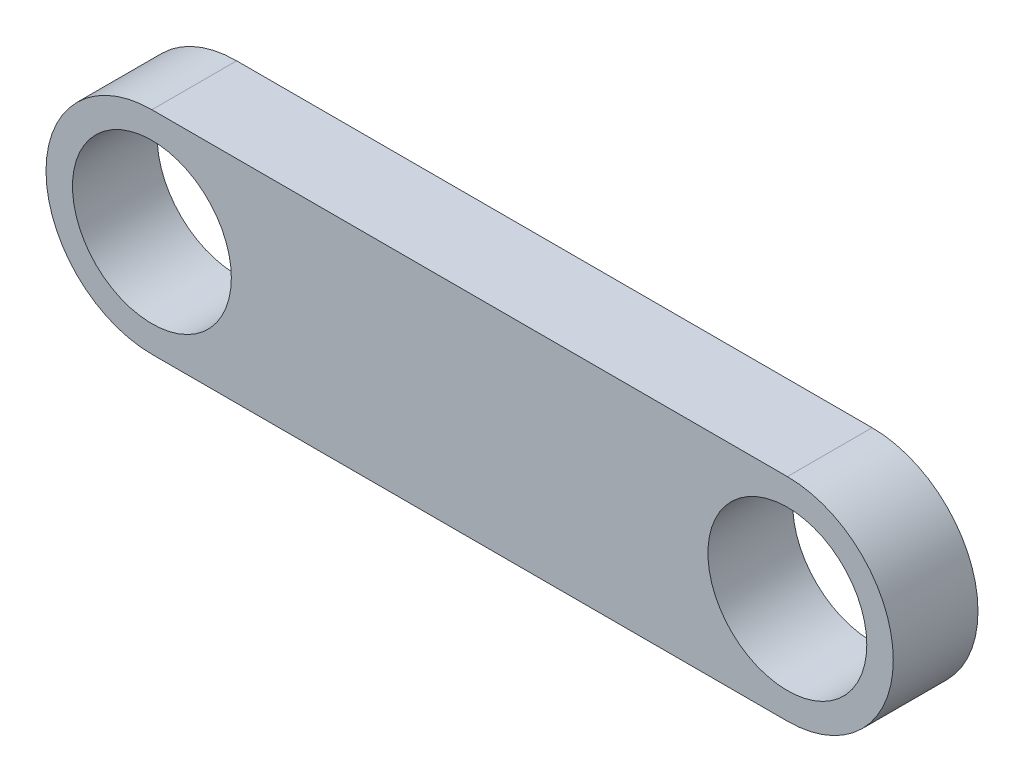
ISO-10303-21;
HEADER;
FILE_DESCRIPTION(('STEP AP214'),'2;1');
FILE_NAME('part.step','',(''),(''),'','','');
FILE_SCHEMA(('AUTOMOTIVE_DESIGN { 1 0 10303 214 1 1 1 1 }'));
ENDSEC;
DATA;
#1=APPLICATION_CONTEXT('core data for automotive mechanical design processes');
#2=APPLICATION_PROTOCOL_DEFINITION('international standard','automotive_design',2000,#1);
#3=PRODUCT_CONTEXT('',#1,'mechanical');
#4=PRODUCT('Part','Part','',(#3));
#5=PRODUCT_RELATED_PRODUCT_CATEGORY('part','',(#4));
#6=PRODUCT_DEFINITION_FORMATION('','',#4);
#7=PRODUCT_DEFINITION_CONTEXT('part definition',#1,'design');
#8=PRODUCT_DEFINITION('design','',#6,#7);
#9=PRODUCT_DEFINITION_SHAPE('','',#8);
#10=(LENGTH_UNIT() NAMED_UNIT(*) SI_UNIT(.MILLI.,.METRE.));
#11=(NAMED_UNIT(*) PLANE_ANGLE_UNIT() SI_UNIT($,.RADIAN.));
#12=(NAMED_UNIT(*) SI_UNIT($,.STERADIAN.) SOLID_ANGLE_UNIT());
#13=UNCERTAINTY_MEASURE_WITH_UNIT(LENGTH_MEASURE(1.E-05),#10,'distance_accuracy_value','');
#14=(GEOMETRIC_REPRESENTATION_CONTEXT(3) GLOBAL_UNCERTAINTY_ASSIGNED_CONTEXT((#13)) GLOBAL_UNIT_ASSIGNED_CONTEXT((#10,
#11,#12)) REPRESENTATION_CONTEXT('',''));
#15=CARTESIAN_POINT('',(0.,0.,0.));
#16=DIRECTION('',(0.,0.,1.));
#17=DIRECTION('',(1.,0.,0.));
#18=AXIS2_PLACEMENT_3D('',#15,#16,#17);
#19=CARTESIAN_POINT('',(0.,0.,-40.));
#20=DIRECTION('',(0.,0.,1.));
#21=DIRECTION('',(1.,0.,0.));
#22=AXIS2_PLACEMENT_3D('',#19,#20,#21);
#23=CYLINDRICAL_SURFACE('',#22,100.);
#24=DIRECTION('',(0.,0.,1.));
#25=VECTOR('',#24,1.);
#26=CARTESIAN_POINT('',(0.,-100.,-40.));
#27=LINE('',#26,#25);
#28=CARTESIAN_POINT('',(0.,-100.,-40.));
#29=VERTEX_POINT('',#28);
#30=CARTESIAN_POINT('',(0.,-100.,40.));
#31=VERTEX_POINT('',#30);
#32=EDGE_CURVE('E95',#29,#31,#27,.T.);
#33=ORIENTED_EDGE('',*,*,#32,.T.);
#34=CARTESIAN_POINT('',(0.,0.,40.));
#35=DIRECTION('',(0.,0.,1.));
#36=DIRECTION('',(1.,0.,0.));
#37=AXIS2_PLACEMENT_3D('',#34,#35,#36);
#38=CIRCLE('',#37,100.);
#39=CARTESIAN_POINT('',(0.,100.,40.));
#40=VERTEX_POINT('',#39);
#41=EDGE_CURVE('E98',#40,#31,#38,.T.);
#42=ORIENTED_EDGE('',*,*,#41,.F.);
#43=DIRECTION('',(0.,0.,1.));
#44=VECTOR('',#43,1.);
#45=CARTESIAN_POINT('',(0.,100.,-40.));
#46=LINE('',#45,#44);
#47=CARTESIAN_POINT('',(0.,100.,-40.));
#48=VERTEX_POINT('',#47);
#49=EDGE_CURVE('E12',#48,#40,#46,.T.);
#50=ORIENTED_EDGE('',*,*,#49,.F.);
#51=CARTESIAN_POINT('',(0.,0.,-40.));
#52=DIRECTION('',(0.,0.,1.));
#53=DIRECTION('',(1.,0.,0.));
#54=AXIS2_PLACEMENT_3D('',#51,#52,#53);
#55=CIRCLE('',#54,100.);
#56=EDGE_CURVE('E100',#48,#29,#55,.T.);
#57=ORIENTED_EDGE('',*,*,#56,.T.);
#58=EDGE_LOOP('',(#33,#42,#50,#57));
#59=FACE_BOUND('',#58,.T.);
#60=ADVANCED_FACE('F55',(#59),#23,.T.);
#61=CARTESIAN_POINT('',(0.,100.,-40.));
#62=DIRECTION('',(0.,-1.,0.));
#63=DIRECTION('',(0.,0.,-1.));
#64=AXIS2_PLACEMENT_3D('',#61,#62,#63);
#65=PLANE('',#64);
#66=ORIENTED_EDGE('',*,*,#49,.T.);
#67=DIRECTION('',(1.,0.,0.));
#68=VECTOR('',#67,1.);
#69=CARTESIAN_POINT('',(0.,100.,40.));
#70=LINE('',#69,#68);
#71=CARTESIAN_POINT('',(600.,100.,40.));
#72=VERTEX_POINT('',#71);
#73=EDGE_CURVE('E118',#40,#72,#70,.T.);
#74=ORIENTED_EDGE('',*,*,#73,.T.);
#75=DIRECTION('',(0.,0.,1.));
#76=VECTOR('',#75,1.);
#77=CARTESIAN_POINT('',(600.,100.,-40.));
#78=LINE('',#77,#76);
#79=CARTESIAN_POINT('',(600.,100.,-40.));
#80=VERTEX_POINT('',#79);
#81=EDGE_CURVE('E64',#80,#72,#78,.T.);
#82=ORIENTED_EDGE('',*,*,#81,.F.);
#83=DIRECTION('',(1.,0.,0.));
#84=VECTOR('',#83,1.);
#85=CARTESIAN_POINT('',(0.,100.,-40.));
#86=LINE('',#85,#84);
#87=EDGE_CURVE('E77',#48,#80,#86,.T.);
#88=ORIENTED_EDGE('',*,*,#87,.F.);
#89=EDGE_LOOP('',(#66,#74,#82,#88));
#90=FACE_BOUND('',#89,.T.);
#91=ADVANCED_FACE('F170',(#90),#65,.F.);
#92=CARTESIAN_POINT('',(600.,0.,-40.));
#93=DIRECTION('',(0.,0.,1.));
#94=DIRECTION('',(1.,0.,0.));
#95=AXIS2_PLACEMENT_3D('',#92,#93,#94);
#96=CYLINDRICAL_SURFACE('',#95,100.);
#97=ORIENTED_EDGE('',*,*,#81,.T.);
#98=CARTESIAN_POINT('',(600.,0.,40.));
#99=DIRECTION('',(0.,0.,1.));
#100=DIRECTION('',(1.,0.,0.));
#101=AXIS2_PLACEMENT_3D('',#98,#99,#100);
#102=CIRCLE('',#101,100.);
#103=CARTESIAN_POINT('',(600.,-100.,40.));
#104=VERTEX_POINT('',#103);
#105=EDGE_CURVE('E114',#104,#72,#102,.T.);
#106=ORIENTED_EDGE('',*,*,#105,.F.);
#107=DIRECTION('',(0.,0.,1.));
#108=VECTOR('',#107,1.);
#109=CARTESIAN_POINT('',(600.,-100.,-40.));
#110=LINE('',#109,#108);
#111=CARTESIAN_POINT('',(600.,-100.,-40.));
#112=VERTEX_POINT('',#111);
#113=EDGE_CURVE('E105',#112,#104,#110,.T.);
#114=ORIENTED_EDGE('',*,*,#113,.F.);
#115=CARTESIAN_POINT('',(600.,0.,-40.));
#116=DIRECTION('',(0.,0.,1.));
#117=DIRECTION('',(1.,0.,0.));
#118=AXIS2_PLACEMENT_3D('',#115,#116,#117);
#119=CIRCLE('',#118,100.);
#120=EDGE_CURVE('E137',#112,#80,#119,.T.);
#121=ORIENTED_EDGE('',*,*,#120,.T.);
#122=EDGE_LOOP('',(#97,#106,#114,#121));
#123=FACE_BOUND('',#122,.T.);
#124=ADVANCED_FACE('F174',(#123),#96,.T.);
#125=CARTESIAN_POINT('',(0.,-100.,-40.));
#126=DIRECTION('',(0.,-1.,0.));
#127=DIRECTION('',(0.,0.,-1.));
#128=AXIS2_PLACEMENT_3D('',#125,#126,#127);
#129=PLANE('',#128);
#130=ORIENTED_EDGE('',*,*,#113,.T.);
#131=DIRECTION('',(1.,0.,0.));
#132=VECTOR('',#131,1.);
#133=CARTESIAN_POINT('',(0.,-100.,40.));
#134=LINE('',#133,#132);
#135=EDGE_CURVE('E108',#31,#104,#134,.T.);
#136=ORIENTED_EDGE('',*,*,#135,.F.);
#137=ORIENTED_EDGE('',*,*,#32,.F.);
#138=DIRECTION('',(1.,0.,0.));
#139=VECTOR('',#138,1.);
#140=CARTESIAN_POINT('',(0.,-100.,-40.));
#141=LINE('',#140,#139);
#142=EDGE_CURVE('E134',#29,#112,#141,.T.);
#143=ORIENTED_EDGE('',*,*,#142,.T.);
#144=EDGE_LOOP('',(#130,#136,#137,#143));
#145=FACE_BOUND('',#144,.T.);
#146=ADVANCED_FACE('F109',(#145),#129,.T.);
#147=CARTESIAN_POINT('',(0.,0.,-40.));
#148=DIRECTION('',(0.,0.,1.));
#149=DIRECTION('',(1.,0.,0.));
#150=AXIS2_PLACEMENT_3D('',#147,#148,#149);
#151=PLANE('',#150);
#152=CARTESIAN_POINT('',(600.,0.,-40.));
#153=DIRECTION('',(0.,0.,1.));
#154=DIRECTION('',(1.,0.,0.));
#155=AXIS2_PLACEMENT_3D('',#152,#153,#154);
#156=CIRCLE('',#155,75.);
#157=CARTESIAN_POINT('',(675.,0.,-40.));
#158=VERTEX_POINT('',#157);
#159=EDGE_CURVE('E148',#158,#158,#156,.F.);
#160=ORIENTED_EDGE('',*,*,#159,.F.);
#161=EDGE_LOOP('',(#160));
#162=FACE_BOUND('',#161,.T.);
#163=CARTESIAN_POINT('',(0.,0.,-40.));
#164=DIRECTION('',(0.,0.,1.));
#165=DIRECTION('',(1.,0.,0.));
#166=AXIS2_PLACEMENT_3D('',#163,#164,#165);
#167=CIRCLE('',#166,75.);
#168=CARTESIAN_POINT('',(75.,0.,-40.));
#169=VERTEX_POINT('',#168);
#170=EDGE_CURVE('E120',#169,#169,#167,.F.);
#171=ORIENTED_EDGE('',*,*,#170,.F.);
#172=EDGE_LOOP('',(#171));
#173=FACE_BOUND('',#172,.T.);
#174=ORIENTED_EDGE('',*,*,#56,.F.);
#175=ORIENTED_EDGE('',*,*,#87,.T.);
#176=ORIENTED_EDGE('',*,*,#120,.F.);
#177=ORIENTED_EDGE('',*,*,#142,.F.);
#178=EDGE_LOOP('',(#174,#175,#176,#177));
#179=FACE_BOUND('',#178,.T.);
#180=ADVANCED_FACE('F183',(#162,#173,#179),#151,.F.);
#181=CARTESIAN_POINT('',(0.,0.,40.));
#182=DIRECTION('',(0.,0.,1.));
#183=DIRECTION('',(1.,0.,0.));
#184=AXIS2_PLACEMENT_3D('',#181,#182,#183);
#185=PLANE('',#184);
#186=CARTESIAN_POINT('',(600.,0.,40.));
#187=DIRECTION('',(0.,0.,1.));
#188=DIRECTION('',(1.,0.,0.));
#189=AXIS2_PLACEMENT_3D('',#186,#187,#188);
#190=CIRCLE('',#189,75.);
#191=CARTESIAN_POINT('',(675.,0.,40.));
#192=VERTEX_POINT('',#191);
#193=EDGE_CURVE('E58',#192,#192,#190,.F.);
#194=ORIENTED_EDGE('',*,*,#193,.T.);
#195=EDGE_LOOP('',(#194));
#196=FACE_BOUND('',#195,.T.);
#197=CARTESIAN_POINT('',(0.,0.,40.));
#198=DIRECTION('',(0.,0.,1.));
#199=DIRECTION('',(1.,0.,0.));
#200=AXIS2_PLACEMENT_3D('',#197,#198,#199);
#201=CIRCLE('',#200,75.);
#202=CARTESIAN_POINT('',(75.,0.,40.));
#203=VERTEX_POINT('',#202);
#204=EDGE_CURVE('E124',#203,#203,#201,.F.);
#205=ORIENTED_EDGE('',*,*,#204,.T.);
#206=EDGE_LOOP('',(#205));
#207=FACE_BOUND('',#206,.T.);
#208=ORIENTED_EDGE('',*,*,#41,.T.);
#209=ORIENTED_EDGE('',*,*,#135,.T.);
#210=ORIENTED_EDGE('',*,*,#105,.T.);
#211=ORIENTED_EDGE('',*,*,#73,.F.);
#212=EDGE_LOOP('',(#208,#209,#210,#211));
#213=FACE_BOUND('',#212,.T.);
#214=ADVANCED_FACE('F116',(#196,#207,#213),#185,.T.);
#215=CARTESIAN_POINT('',(0.,0.,200.));
#216=DIRECTION('',(0.,0.,-1.));
#217=DIRECTION('',(-1.,0.,0.));
#218=AXIS2_PLACEMENT_3D('',#215,#216,#217);
#219=CYLINDRICAL_SURFACE('',#218,75.);
#220=ORIENTED_EDGE('',*,*,#204,.F.);
#221=EDGE_LOOP('',(#220));
#222=FACE_BOUND('',#221,.T.);
#223=ORIENTED_EDGE('',*,*,#170,.T.);
#224=EDGE_LOOP('',(#223));
#225=FACE_BOUND('',#224,.T.);
#226=ADVANCED_FACE('F162',(#222,#225),#219,.F.);
#227=CARTESIAN_POINT('',(600.,0.,200.));
#228=DIRECTION('',(0.,0.,-1.));
#229=DIRECTION('',(-1.,0.,0.));
#230=AXIS2_PLACEMENT_3D('',#227,#228,#229);
#231=CYLINDRICAL_SURFACE('',#230,75.);
#232=ORIENTED_EDGE('',*,*,#193,.F.);
#233=EDGE_LOOP('',(#232));
#234=FACE_BOUND('',#233,.T.);
#235=ORIENTED_EDGE('',*,*,#159,.T.);
#236=EDGE_LOOP('',(#235));
#237=FACE_BOUND('',#236,.T.);
#238=ADVANCED_FACE('F160',(#234,#237),#231,.F.);
#239=CLOSED_SHELL('',(#60,#91,#124,#146,#180,#214,#226,#238));
#240=MANIFOLD_SOLID_BREP('B2',#239);
#241=ADVANCED_BREP_SHAPE_REPRESENTATION('',(#18,#240),#14);
#242=SHAPE_DEFINITION_REPRESENTATION(#9,#241);
ENDSEC;
END-ISO-10303-21;
